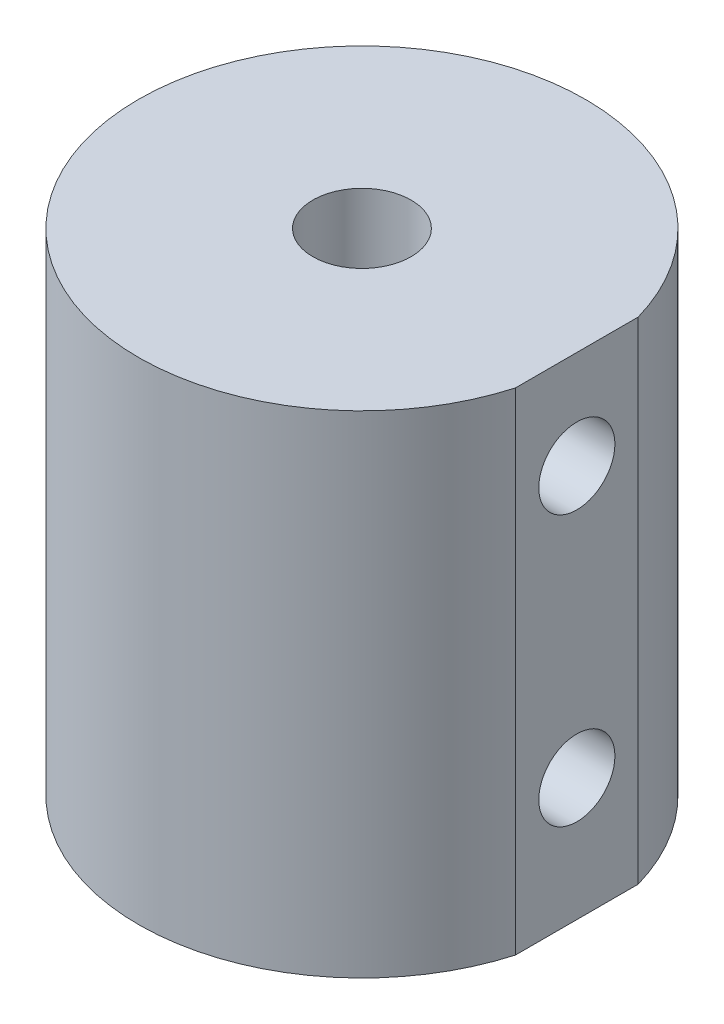
ISO-10303-21;
HEADER;
FILE_DESCRIPTION(('STEP AP214'),'2;1');
FILE_NAME('part.step','',(''),(''),'','','');
FILE_SCHEMA(('AUTOMOTIVE_DESIGN { 1 0 10303 214 1 1 1 1 }'));
ENDSEC;
DATA;
#1=APPLICATION_CONTEXT('core data for automotive mechanical design processes');
#2=APPLICATION_PROTOCOL_DEFINITION('international standard','automotive_design',2000,#1);
#3=PRODUCT_CONTEXT('',#1,'mechanical');
#4=PRODUCT('Part','Part','',(#3));
#5=PRODUCT_RELATED_PRODUCT_CATEGORY('part','',(#4));
#6=PRODUCT_DEFINITION_FORMATION('','',#4);
#7=PRODUCT_DEFINITION_CONTEXT('part definition',#1,'design');
#8=PRODUCT_DEFINITION('design','',#6,#7);
#9=PRODUCT_DEFINITION_SHAPE('','',#8);
#10=(LENGTH_UNIT() NAMED_UNIT(*) SI_UNIT(.MILLI.,.METRE.));
#11=(NAMED_UNIT(*) PLANE_ANGLE_UNIT() SI_UNIT($,.RADIAN.));
#12=(NAMED_UNIT(*) SI_UNIT($,.STERADIAN.) SOLID_ANGLE_UNIT());
#13=UNCERTAINTY_MEASURE_WITH_UNIT(LENGTH_MEASURE(1.E-05),#10,'distance_accuracy_value','');
#14=(GEOMETRIC_REPRESENTATION_CONTEXT(3) GLOBAL_UNCERTAINTY_ASSIGNED_CONTEXT((#13)) GLOBAL_UNIT_ASSIGNED_CONTEXT((#10,
#11,#12)) REPRESENTATION_CONTEXT('',''));
#15=CARTESIAN_POINT('',(0.,0.,0.));
#16=DIRECTION('',(0.,0.,1.));
#17=DIRECTION('',(1.,0.,0.));
#18=AXIS2_PLACEMENT_3D('',#15,#16,#17);
#19=CARTESIAN_POINT('',(0.,22.,0.));
#20=DIRECTION('',(0.,-1.,0.));
#21=DIRECTION('',(0.,0.,-1.));
#22=AXIS2_PLACEMENT_3D('',#19,#20,#21);
#23=CYLINDRICAL_SURFACE('',#22,6.2);
#24=CARTESIAN_POINT('',(5.36935750346352,10.,-3.1));
#25=CARTESIAN_POINT('',(5.36935849423128,9.91919309229893,-3.09999907904929));
#26=CARTESIAN_POINT('',(5.37119000564164,9.83837633491994,-3.09683398248055));
#27=CARTESIAN_POINT('',(5.37843729379027,9.67738498901988,-3.08422684220326));
#28=CARTESIAN_POINT('',(5.38385473918285,9.59721071705589,-3.07478187625349));
#29=CARTESIAN_POINT('',(5.40524473910147,9.35835785194535,-3.03714142666641));
#30=CARTESIAN_POINT('',(5.42635445827456,9.2014907257823,-2.9996406600873));
#31=CARTESIAN_POINT('',(5.47922671825124,8.89806197869233,-2.9019099802584));
#32=CARTESIAN_POINT('',(5.51093253297182,8.7514504048574,-2.84180088991504));
#33=CARTESIAN_POINT('',(5.58132342065871,8.47039514624248,-2.70092929096817));
#34=CARTESIAN_POINT('',(5.62000887116059,8.33595212026258,-2.62016566504122));
#35=CARTESIAN_POINT('',(5.70390269678499,8.07084918231402,-2.43246628698421));
#36=CARTESIAN_POINT('',(5.74938590724018,7.94141585777221,-2.32392131508609));
#37=CARTESIAN_POINT('',(5.83953153192583,7.70163481798747,-2.08708680056294));
#38=CARTESIAN_POINT('',(5.88419352687141,7.59129662280141,-1.9587874691042));
#39=CARTESIAN_POINT('',(5.9712657662185,7.38556158934325,-1.67551764746134));
#40=CARTESIAN_POINT('',(6.0133212937732,7.29167325520853,-1.51933228609627));
#41=CARTESIAN_POINT('',(6.08687344427226,7.13206341932432,-1.19088678230127));
#42=CARTESIAN_POINT('',(6.11837672813838,7.06632414164521,-1.01863686847486));
#43=CARTESIAN_POINT('',(6.1652942972316,6.96973553541119,-0.675939325941493));
#44=CARTESIAN_POINT('',(6.18169388615426,6.93673646769701,-0.506235549496172));
#45=CARTESIAN_POINT('',(6.20023509992105,6.89948503270785,-0.162968949981872));
#46=CARTESIAN_POINT('',(6.2023853517552,6.89521527179667,0.0105914742714049));
#47=CARTESIAN_POINT('',(6.19265243810165,6.9147147003893,0.340480829223517));
#48=CARTESIAN_POINT('',(6.18197336822898,6.93607789101398,0.496995730028075));
#49=CARTESIAN_POINT('',(6.1496016074805,7.00193057320304,0.803872680365835));
#50=CARTESIAN_POINT('',(6.12790809246368,7.04642179529714,0.95423426857585));
#51=CARTESIAN_POINT('',(6.07511906528484,7.15755611762856,1.24715916132865));
#52=CARTESIAN_POINT('',(6.04389762496686,7.22449718224067,1.38958579113101));
#53=CARTESIAN_POINT('',(5.974867088048,7.37821597859821,1.66152790639347));
#54=CARTESIAN_POINT('',(5.93705563412519,7.46500081215998,1.79103874557764));
#55=CARTESIAN_POINT('',(5.85417597108505,7.66537808973752,2.046539077545));
#56=CARTESIAN_POINT('',(5.80875966134252,7.78072912766304,2.17103847180998));
#57=CARTESIAN_POINT('',(5.71808555355372,8.03021839997249,2.39972070652991));
#58=CARTESIAN_POINT('',(5.67282790352699,8.1643709536922,2.50388791583267));
#59=CARTESIAN_POINT('',(5.58446487487709,8.45824821478541,2.69547785312232));
#60=CARTESIAN_POINT('',(5.54167868609022,8.61905585016752,2.78141716281227));
#61=CARTESIAN_POINT('',(5.48612367555622,8.87114848976548,2.88860932108338));
#62=CARTESIAN_POINT('',(5.46904011378611,8.95701152075159,2.92072490586735));
#63=CARTESIAN_POINT('',(5.43841755912045,9.13180222313558,2.97735674116434));
#64=CARTESIAN_POINT('',(5.42487638127782,9.22072796695728,3.00187767779158));
#65=CARTESIAN_POINT('',(5.40283971188006,9.39381734089816,3.04134725583264));
#66=CARTESIAN_POINT('',(5.39403081671987,9.47780440649244,3.05689771063369));
#67=CARTESIAN_POINT('',(5.38028495062534,9.64704974662143,3.08102699974204));
#68=CARTESIAN_POINT('',(5.37534596617756,9.73230733653993,3.0896094595793));
#69=CARTESIAN_POINT('',(5.36954784959061,9.90335337369613,3.09967619271723));
#70=CARTESIAN_POINT('',(5.36868719827086,9.98914161134182,3.1011631091119));
#71=CARTESIAN_POINT('',(5.37106984973299,10.1604626761235,3.09703167288649));
#72=CARTESIAN_POINT('',(5.37431287550024,10.2459955201089,3.09141379986816));
#73=CARTESIAN_POINT('',(5.38887976110589,10.4824211072441,3.06600473072253));
#74=CARTESIAN_POINT('',(5.40453132682514,10.632307837272,3.03858035203519));
#75=CARTESIAN_POINT('',(5.4465105526398,10.9249686078234,2.96266036274304));
#76=CARTESIAN_POINT('',(5.4728416699639,11.0677403282246,2.91415792829889));
#77=CARTESIAN_POINT('',(5.53462406282133,11.3497669740506,2.79510698627724));
#78=CARTESIAN_POINT('',(5.57044125759821,11.4885527588342,2.7236414525805));
#79=CARTESIAN_POINT('',(5.6468393871883,11.7529569363116,2.56149004339049));
#80=CARTESIAN_POINT('',(5.68742276434251,11.8785685151718,2.47079429439281));
#81=CARTESIAN_POINT('',(5.77492805311645,12.1296334808529,2.25939517218993));
#82=CARTESIAN_POINT('',(5.82200410487562,12.25307097993,2.13635033182713));
#83=CARTESIAN_POINT('',(5.91276125721287,12.478178125138,1.87055394808812));
#84=CARTESIAN_POINT('',(5.95644120785165,12.5798404183314,1.72779577469598));
#85=CARTESIAN_POINT('',(6.03698222000196,12.7607784984928,1.42145962058159));
#86=CARTESIAN_POINT('',(6.07363289401112,12.8393926532792,1.25743160191474));
#87=CARTESIAN_POINT('',(6.13438400156203,12.9671275151209,0.916119330951869));
#88=CARTESIAN_POINT('',(6.15849545283517,13.0162741200034,0.738846873228143));
#89=CARTESIAN_POINT('',(6.18969275466686,13.0794425482441,0.393637016212105));
#90=CARTESIAN_POINT('',(6.19813776728391,13.0962734234128,0.226335480172071));
#91=CARTESIAN_POINT('',(6.20130603949982,13.1026141147147,-0.108890560682905));
#92=CARTESIAN_POINT('',(6.19603410258589,13.0921334949559,-0.276814826861375));
#93=CARTESIAN_POINT('',(6.1731530409699,13.0460091701954,-0.596867761287344));
#94=CARTESIAN_POINT('',(6.15637975990525,13.0120690810788,-0.749308131289313));
#95=CARTESIAN_POINT('',(6.11295487836495,12.9222861883669,-1.04608250570255));
#96=CARTESIAN_POINT('',(6.08630186130105,12.8664402437728,-1.19041534421082));
#97=CARTESIAN_POINT('',(6.02410395101986,12.731946580355,-1.47381234992002));
#98=CARTESIAN_POINT('',(5.98822750544064,12.6524257804125,-1.61238714534359));
#99=CARTESIAN_POINT('',(5.91133175494743,12.473928731206,-1.8748021870168));
#100=CARTESIAN_POINT('',(5.8703100910879,12.374943546145,-1.99863562366143));
#101=CARTESIAN_POINT('',(5.78238844780087,12.148935786767,-2.24103013557374));
#102=CARTESIAN_POINT('',(5.73530974688002,12.0201033018673,-2.35784002450804));
#103=CARTESIAN_POINT('',(5.64394937826666,11.7438757276609,-2.56886899975796));
#104=CARTESIAN_POINT('',(5.59967021042567,11.5964643902679,-2.66306809984262));
#105=CARTESIAN_POINT('',(5.53871600737221,11.3613838135882,-2.78654411320572));
#106=CARTESIAN_POINT('',(5.51904593120079,11.2792916723182,-2.82518922387767));
#107=CARTESIAN_POINT('',(5.48258542499175,11.1115016075577,-2.89530966214055));
#108=CARTESIAN_POINT('',(5.46579351278158,11.0258055684604,-2.92678868282136));
#109=CARTESIAN_POINT('',(5.43580056397125,10.8516271098846,-2.98212378739856));
#110=CARTESIAN_POINT('',(5.42259030292728,10.7631525158506,-3.00599948171041));
#111=CARTESIAN_POINT('',(5.40029165279283,10.5839829028419,-3.04587842320017));
#112=CARTESIAN_POINT('',(5.39120038218454,10.4932894830487,-3.06188717451275));
#113=CARTESIAN_POINT('',(5.37941478950005,10.3354212216481,-3.08253027266578));
#114=CARTESIAN_POINT('',(5.37565257341076,10.2685686974628,-3.08907504435993));
#115=CARTESIAN_POINT('',(5.37062343469509,10.134479739307,-3.09781043685213));
#116=CARTESIAN_POINT('',(5.36935667899844,10.0672432799555,-3.10000076636699));
#117=CARTESIAN_POINT('',(5.36935750346352,10.,-3.1));
#118=B_SPLINE_CURVE_WITH_KNOTS('',3,(#24,#25,#26,#27,#28,#29,#30,#31,#32,#33,#34,#35,#36,#37,
#38,#39,#40,#41,#42,#43,#44,#45,#46,#47,#48,#49,#50,#51,#52,#53,#54,#55,#56,#57,#58,#59,#60,#61,
#62,#63,#64,#65,#66,#67,#68,#69,#70,#71,#72,#73,#74,#75,#76,#77,#78,#79,#80,#81,#82,#83,#84,#85,
#86,#87,#88,#89,#90,#91,#92,#93,#94,#95,#96,#97,#98,#99,#100,#101,#102,#103,#104,#105,#106,#107,
#108,#109,#110,#111,#112,#113,#114,#115,#116,#117),.UNSPECIFIED.,.T.,.F.,(4,2,2,2,2,2,2,2,2,2,2,
2,2,2,2,2,2,2,2,2,2,2,2,2,2,2,2,2,2,2,2,2,2,2,2,2,2,2,2,2,2,2,2,2,2,2,4),(0.,0.242347078425021,
0.48480700835774,0.970145396071016,1.45292607569951,1.93573287725712,2.45836059712168,
2.98124813199265,3.53938208777882,4.09716306425778,4.61525546238314,5.13303416264439,
5.60578645039784,6.07857411641826,6.5579030050427,7.03740370823558,7.56223036354076,
8.08745892400063,8.64604152199005,8.92544679990473,9.20467933175738,9.46191920813846,
9.71902515364592,9.97603531956145,10.2330281371869,10.6902809344922,11.1476818738653,
11.6262674369361,12.1050993211688,12.6442902993464,13.1836630626716,13.7372708721493,
14.2903914224193,14.7927616304215,15.2949559389605,15.7640584193636,16.2332281872198,
16.722464520651,17.2119259814697,17.7500987456995,18.2887454765471,18.566945308967,
18.8450014431219,19.1223344979518,19.3994732384786,19.60112830617,19.8027968627891),.UNSPECIFIED.);
#119=CARTESIAN_POINT('',(5.36935750346352,10.,-3.1));
#120=VERTEX_POINT('',#119);
#121=EDGE_CURVE('E143',#120,#120,#118,.T.);
#122=ORIENTED_EDGE('',*,*,#121,.F.);
#123=EDGE_LOOP('',(#122));
#124=FACE_BOUND('',#123,.T.);
#125=CARTESIAN_POINT('',(0.,0.,0.));
#126=DIRECTION('',(0.,1.,0.));
#127=DIRECTION('',(0.,0.,1.));
#128=AXIS2_PLACEMENT_3D('',#125,#126,#127);
#129=CIRCLE('',#128,6.2);
#130=CARTESIAN_POINT('',(-2.,0.,-5.86856030044848));
#131=VERTEX_POINT('',#130);
#132=CARTESIAN_POINT('',(2.,0.,-5.86856030044848));
#133=VERTEX_POINT('',#132);
#134=EDGE_CURVE('E103',#131,#133,#129,.T.);
#135=ORIENTED_EDGE('',*,*,#134,.F.);
#136=DIRECTION('',(0.,-1.,0.));
#137=VECTOR('',#136,1.);
#138=CARTESIAN_POINT('',(-2.,22.,-5.86856030044848));
#139=LINE('',#138,#137);
#140=CARTESIAN_POINT('',(-2.,22.,-5.86856030044848));
#141=VERTEX_POINT('',#140);
#142=EDGE_CURVE('E11',#141,#131,#139,.T.);
#143=ORIENTED_EDGE('',*,*,#142,.F.);
#144=CARTESIAN_POINT('',(0.,22.,0.));
#145=DIRECTION('',(0.,1.,0.));
#146=DIRECTION('',(0.,0.,1.));
#147=AXIS2_PLACEMENT_3D('',#144,#145,#146);
#148=CIRCLE('',#147,6.2);
#149=CARTESIAN_POINT('',(2.,22.,-5.86856030044848));
#150=VERTEX_POINT('',#149);
#151=EDGE_CURVE('E107',#141,#150,#148,.T.);
#152=ORIENTED_EDGE('',*,*,#151,.T.);
#153=DIRECTION('',(0.,-1.,0.));
#154=VECTOR('',#153,1.);
#155=CARTESIAN_POINT('',(2.,22.,-5.86856030044848));
#156=LINE('',#155,#154);
#157=EDGE_CURVE('E88',#150,#133,#156,.T.);
#158=ORIENTED_EDGE('',*,*,#157,.T.);
#159=EDGE_LOOP('',(#135,#143,#152,#158));
#160=FACE_BOUND('',#159,.T.);
#161=ADVANCED_FACE('F39',(#124,#160),#23,.F.);
#162=CARTESIAN_POINT('',(-2.,22.,0.));
#163=DIRECTION('',(-1.,0.,0.));
#164=DIRECTION('',(0.,0.,1.));
#165=AXIS2_PLACEMENT_3D('',#162,#163,#164);
#166=PLANE('',#165);
#167=DIRECTION('',(0.,0.,-1.));
#168=VECTOR('',#167,1.);
#169=CARTESIAN_POINT('',(-2.,0.,0.));
#170=LINE('',#169,#168);
#171=CARTESIAN_POINT('',(-2.,0.,-7.3));
#172=VERTEX_POINT('',#171);
#173=EDGE_CURVE('E97',#131,#172,#170,.T.);
#174=ORIENTED_EDGE('',*,*,#173,.T.);
#175=DIRECTION('',(0.,-1.,0.));
#176=VECTOR('',#175,1.);
#177=CARTESIAN_POINT('',(-2.,22.,-7.3));
#178=LINE('',#177,#176);
#179=CARTESIAN_POINT('',(-2.,22.,-7.3));
#180=VERTEX_POINT('',#179);
#181=EDGE_CURVE('E47',#180,#172,#178,.T.);
#182=ORIENTED_EDGE('',*,*,#181,.F.);
#183=DIRECTION('',(0.,0.,-1.));
#184=VECTOR('',#183,1.);
#185=CARTESIAN_POINT('',(-2.,22.,0.));
#186=LINE('',#185,#184);
#187=EDGE_CURVE('E114',#141,#180,#186,.T.);
#188=ORIENTED_EDGE('',*,*,#187,.F.);
#189=ORIENTED_EDGE('',*,*,#142,.T.);
#190=EDGE_LOOP('',(#174,#182,#188,#189));
#191=FACE_BOUND('',#190,.T.);
#192=ADVANCED_FACE('F120',(#191),#166,.F.);
#193=CARTESIAN_POINT('',(0.,22.,-7.3));
#194=DIRECTION('',(0.,0.,1.));
#195=DIRECTION('',(1.,0.,0.));
#196=AXIS2_PLACEMENT_3D('',#193,#194,#195);
#197=PLANE('',#196);
#198=DIRECTION('',(-1.,0.,0.));
#199=VECTOR('',#198,1.);
#200=CARTESIAN_POINT('',(0.,0.,-7.3));
#201=LINE('',#200,#199);
#202=CARTESIAN_POINT('',(2.,0.,-7.3));
#203=VERTEX_POINT('',#202);
#204=EDGE_CURVE('E91',#203,#172,#201,.T.);
#205=ORIENTED_EDGE('',*,*,#204,.F.);
#206=DIRECTION('',(0.,-1.,0.));
#207=VECTOR('',#206,1.);
#208=CARTESIAN_POINT('',(2.,22.,-7.3));
#209=LINE('',#208,#207);
#210=CARTESIAN_POINT('',(2.,22.,-7.3));
#211=VERTEX_POINT('',#210);
#212=EDGE_CURVE('E80',#211,#203,#209,.T.);
#213=ORIENTED_EDGE('',*,*,#212,.F.);
#214=DIRECTION('',(-1.,0.,0.));
#215=VECTOR('',#214,1.);
#216=CARTESIAN_POINT('',(0.,22.,-7.3));
#217=LINE('',#216,#215);
#218=EDGE_CURVE('E63',#211,#180,#217,.T.);
#219=ORIENTED_EDGE('',*,*,#218,.T.);
#220=ORIENTED_EDGE('',*,*,#181,.T.);
#221=EDGE_LOOP('',(#205,#213,#219,#220));
#222=FACE_BOUND('',#221,.T.);
#223=ADVANCED_FACE('F92',(#222),#197,.T.);
#224=CARTESIAN_POINT('',(2.,22.,0.));
#225=DIRECTION('',(-1.,0.,0.));
#226=DIRECTION('',(0.,0.,1.));
#227=AXIS2_PLACEMENT_3D('',#224,#225,#226);
#228=PLANE('',#227);
#229=DIRECTION('',(0.,0.,-1.));
#230=VECTOR('',#229,1.);
#231=CARTESIAN_POINT('',(2.,0.,0.));
#232=LINE('',#231,#230);
#233=EDGE_CURVE('E85',#133,#203,#232,.T.);
#234=ORIENTED_EDGE('',*,*,#233,.F.);
#235=ORIENTED_EDGE('',*,*,#157,.F.);
#236=DIRECTION('',(0.,0.,-1.));
#237=VECTOR('',#236,1.);
#238=CARTESIAN_POINT('',(2.,22.,0.));
#239=LINE('',#238,#237);
#240=EDGE_CURVE('E86',#150,#211,#239,.T.);
#241=ORIENTED_EDGE('',*,*,#240,.T.);
#242=ORIENTED_EDGE('',*,*,#212,.T.);
#243=EDGE_LOOP('',(#234,#235,#241,#242));
#244=FACE_BOUND('',#243,.T.);
#245=ADVANCED_FACE('F82',(#244),#228,.T.);
#246=CARTESIAN_POINT('',(0.,22.,0.));
#247=DIRECTION('',(0.,-1.,0.));
#248=DIRECTION('',(0.,0.,-1.));
#249=AXIS2_PLACEMENT_3D('',#246,#247,#248);
#250=CYLINDRICAL_SURFACE('',#249,18.2);
#251=CARTESIAN_POINT('',(0.,40.,0.));
#252=DIRECTION('',(0.,1.,0.));
#253=DIRECTION('',(0.,0.,1.));
#254=AXIS2_PLACEMENT_3D('',#251,#252,#253);
#255=CIRCLE('',#254,18.2);
#256=CARTESIAN_POINT('',(17.4997142833819,40.,-5.));
#257=VERTEX_POINT('',#256);
#258=CARTESIAN_POINT('',(17.4997142833819,40.,5.));
#259=VERTEX_POINT('',#258);
#260=EDGE_CURVE('E118',#257,#259,#255,.T.);
#261=ORIENTED_EDGE('',*,*,#260,.F.);
#262=DIRECTION('',(0.,-1.,0.));
#263=VECTOR('',#262,1.);
#264=CARTESIAN_POINT('',(17.4997142833819,40.,-5.));
#265=LINE('',#264,#263);
#266=CARTESIAN_POINT('',(17.4997142833819,0.,-5.));
#267=VERTEX_POINT('',#266);
#268=EDGE_CURVE('E54',#257,#267,#265,.T.);
#269=ORIENTED_EDGE('',*,*,#268,.T.);
#270=CARTESIAN_POINT('',(0.,0.,0.));
#271=DIRECTION('',(0.,1.,0.));
#272=DIRECTION('',(0.,0.,1.));
#273=AXIS2_PLACEMENT_3D('',#270,#271,#272);
#274=CIRCLE('',#273,18.2);
#275=CARTESIAN_POINT('',(17.4997142833819,0.,5.));
#276=VERTEX_POINT('',#275);
#277=EDGE_CURVE('E104',#267,#276,#274,.T.);
#278=ORIENTED_EDGE('',*,*,#277,.T.);
#279=DIRECTION('',(0.,-1.,0.));
#280=VECTOR('',#279,1.);
#281=CARTESIAN_POINT('',(17.4997142833819,40.,5.));
#282=LINE('',#281,#280);
#283=EDGE_CURVE('E136',#259,#276,#282,.T.);
#284=ORIENTED_EDGE('',*,*,#283,.F.);
#285=EDGE_LOOP('',(#261,#269,#278,#284));
#286=FACE_BOUND('',#285,.T.);
#287=ADVANCED_FACE('F184',(#286),#250,.T.);
#288=CARTESIAN_POINT('',(0.,0.,0.));
#289=DIRECTION('',(0.,1.,0.));
#290=DIRECTION('',(0.,0.,1.));
#291=AXIS2_PLACEMENT_3D('',#288,#289,#290);
#292=PLANE('',#291);
#293=ORIENTED_EDGE('',*,*,#134,.T.);
#294=ORIENTED_EDGE('',*,*,#233,.T.);
#295=ORIENTED_EDGE('',*,*,#204,.T.);
#296=ORIENTED_EDGE('',*,*,#173,.F.);
#297=EDGE_LOOP('',(#293,#294,#295,#296));
#298=FACE_BOUND('',#297,.T.);
#299=ORIENTED_EDGE('',*,*,#277,.F.);
#300=DIRECTION('',(0.,0.,-1.));
#301=VECTOR('',#300,1.);
#302=CARTESIAN_POINT('',(17.4997142833819,0.,0.));
#303=LINE('',#302,#301);
#304=EDGE_CURVE('E141',#276,#267,#303,.T.);
#305=ORIENTED_EDGE('',*,*,#304,.F.);
#306=EDGE_LOOP('',(#299,#305));
#307=FACE_BOUND('',#306,.T.);
#308=ADVANCED_FACE('F100',(#298,#307),#292,.F.);
#309=CARTESIAN_POINT('',(0.,40.,0.));
#310=DIRECTION('',(0.,1.,0.));
#311=DIRECTION('',(0.,0.,1.));
#312=AXIS2_PLACEMENT_3D('',#309,#310,#311);
#313=PLANE('',#312);
#314=DIRECTION('',(0.,0.,-1.));
#315=VECTOR('',#314,1.);
#316=CARTESIAN_POINT('',(17.4997142833819,40.,0.));
#317=LINE('',#316,#315);
#318=EDGE_CURVE('E139',#259,#257,#317,.T.);
#319=ORIENTED_EDGE('',*,*,#318,.T.);
#320=ORIENTED_EDGE('',*,*,#260,.T.);
#321=EDGE_LOOP('',(#319,#320));
#322=FACE_BOUND('',#321,.T.);
#323=CARTESIAN_POINT('',(0.,40.,0.));
#324=DIRECTION('',(0.,1.,0.));
#325=DIRECTION('',(0.,0.,1.));
#326=AXIS2_PLACEMENT_3D('',#323,#324,#325);
#327=CIRCLE('',#326,4.);
#328=CARTESIAN_POINT('',(0.,40.,4.));
#329=VERTEX_POINT('',#328);
#330=EDGE_CURVE('E130',#329,#329,#327,.T.);
#331=ORIENTED_EDGE('',*,*,#330,.F.);
#332=EDGE_LOOP('',(#331));
#333=FACE_BOUND('',#332,.T.);
#334=ADVANCED_FACE('F176',(#322,#333),#313,.T.);
#335=CARTESIAN_POINT('',(0.,22.,0.));
#336=DIRECTION('',(0.,1.,0.));
#337=DIRECTION('',(0.,0.,1.));
#338=AXIS2_PLACEMENT_3D('',#335,#336,#337);
#339=PLANE('',#338);
#340=ORIENTED_EDGE('',*,*,#151,.F.);
#341=ORIENTED_EDGE('',*,*,#187,.T.);
#342=ORIENTED_EDGE('',*,*,#218,.F.);
#343=ORIENTED_EDGE('',*,*,#240,.F.);
#344=EDGE_LOOP('',(#340,#341,#342,#343));
#345=FACE_BOUND('',#344,.T.);
#346=CARTESIAN_POINT('',(0.,22.,0.));
#347=DIRECTION('',(0.,1.,0.));
#348=DIRECTION('',(0.,0.,1.));
#349=AXIS2_PLACEMENT_3D('',#346,#347,#348);
#350=CIRCLE('',#349,4.);
#351=CARTESIAN_POINT('',(0.,22.,4.));
#352=VERTEX_POINT('',#351);
#353=EDGE_CURVE('E131',#352,#352,#350,.T.);
#354=ORIENTED_EDGE('',*,*,#353,.T.);
#355=EDGE_LOOP('',(#354));
#356=FACE_BOUND('',#355,.T.);
#357=ADVANCED_FACE('F174',(#345,#356),#339,.F.);
#358=CARTESIAN_POINT('',(0.,40.,0.));
#359=DIRECTION('',(0.,-1.,0.));
#360=DIRECTION('',(0.,0.,-1.));
#361=AXIS2_PLACEMENT_3D('',#358,#359,#360);
#362=CYLINDRICAL_SURFACE('',#361,4.);
#363=CARTESIAN_POINT('',(2.52784493195291,32.,-3.1));
#364=CARTESIAN_POINT('',(2.52784574093324,31.9287444288,-3.09999961919335));
#365=CARTESIAN_POINT('',(2.53087865516696,31.8574846886222,-3.09753439791337));
#366=CARTESIAN_POINT('',(2.54278674023402,31.7158063578104,-3.08776425877451));
#367=CARTESIAN_POINT('',(2.55166274719228,31.6453878890278,-3.0804586482729));
#368=CARTESIAN_POINT('',(2.58634576054128,31.4360221780106,-3.05151757485498));
#369=CARTESIAN_POINT('',(2.62020347776894,31.299324292493,-3.02285944185688));
#370=CARTESIAN_POINT('',(2.7116706727409,31.0066480943885,-2.94130207894632));
#371=CARTESIAN_POINT('',(2.77285031642858,30.8529690788111,-2.88447849264687));
#372=CARTESIAN_POINT('',(2.90617907189171,30.5602617481971,-2.75011335563906));
#373=CARTESIAN_POINT('',(2.97834140587635,30.4212514392729,-2.67254674573847));
#374=CARTESIAN_POINT('',(3.12795783572879,30.1542927845103,-2.49592691468352));
#375=CARTESIAN_POINT('',(3.20550191602767,30.0267406781861,-2.39635362356895));
#376=CARTESIAN_POINT('',(3.35786412946307,29.7878353418276,-2.17772837866786));
#377=CARTESIAN_POINT('',(3.43268424504134,29.6764701472335,-2.05869095152822));
#378=CARTESIAN_POINT('',(3.57119162579646,29.4764389681107,-1.80728422149922));
#379=CARTESIAN_POINT('',(3.63522484105603,29.3869871046996,-1.67573700604701));
#380=CARTESIAN_POINT('',(3.75136978376735,29.2276828068128,-1.39643160562369));
#381=CARTESIAN_POINT('',(3.80349281248997,29.1578117782064,-1.24868898673542));
#382=CARTESIAN_POINT('',(3.88467854744165,29.0501233103386,-0.96323655310253));
#383=CARTESIAN_POINT('',(3.91604298335588,29.0090468100325,-0.827419124069906));
#384=CARTESIAN_POINT('',(3.9646543384196,28.945674844881,-0.549029124361632));
#385=CARTESIAN_POINT('',(3.98191037617888,28.9233672489529,-0.406460979987493));
#386=CARTESIAN_POINT('',(4.00087142946686,28.89886573019,-0.118129121638327));
#387=CARTESIAN_POINT('',(4.00253080821742,28.8967308338112,0.0276427199805986));
#388=CARTESIAN_POINT('',(3.99002636463382,28.9128757892941,0.317364296176516));
#389=CARTESIAN_POINT('',(3.97586031159191,28.9311585191661,0.461313770985022));
#390=CARTESIAN_POINT('',(3.93390568713724,28.9857173493483,0.736867543951287));
#391=CARTESIAN_POINT('',(3.90674542775093,29.0211643741372,0.868736309816124));
#392=CARTESIAN_POINT('',(3.84106018790413,29.1078483275179,1.12412799855321));
#393=CARTESIAN_POINT('',(3.80253256208628,29.1590889316377,1.24764897053534));
#394=CARTESIAN_POINT('',(3.71195871888115,29.2814509094203,1.49690817808534));
#395=CARTESIAN_POINT('',(3.65892208872865,29.3540876658485,1.62153590072287));
#396=CARTESIAN_POINT('',(3.54511945328038,29.5138353142811,1.85722616418611));
#397=CARTESIAN_POINT('',(3.48434791242752,29.6009565860675,1.96827887724334));
#398=CARTESIAN_POINT('',(3.3455770173275,29.8068666936579,2.19738156573621));
#399=CARTESIAN_POINT('',(3.26658445312787,29.9284940127446,2.31227714037589));
#400=CARTESIAN_POINT('',(3.10818793012151,30.1885016039668,2.52117680276785));
#401=CARTESIAN_POINT('',(3.02878368206818,30.326895827885,2.61516330503714));
#402=CARTESIAN_POINT('',(2.88948574724759,30.5963647941671,2.76762533135656));
#403=CARTESIAN_POINT('',(2.82851128916836,30.7250172276746,2.82938377606462));
#404=CARTESIAN_POINT('',(2.71799479675336,30.993814186903,2.93570687800955));
#405=CARTESIAN_POINT('',(2.66842731502255,31.1339321682765,2.98030995883444));
#406=CARTESIAN_POINT('',(2.59848268697305,31.3890690652966,3.04130155928721));
#407=CARTESIAN_POINT('',(2.57393793287508,31.501902515863,3.06191407444128));
#408=CARTESIAN_POINT('',(2.53957213723577,31.7312953634618,3.09048502463638));
#409=CARTESIAN_POINT('',(2.52972558665534,31.8478479458355,3.09846538450472));
#410=CARTESIAN_POINT('',(2.52645548046124,32.0816748920254,3.10113404168258));
#411=CARTESIAN_POINT('',(2.53307754981344,32.1989503611451,3.09578541203147));
#412=CARTESIAN_POINT('',(2.56162678367871,32.4303448539752,3.07219543043969));
#413=CARTESIAN_POINT('',(2.58357732445812,32.5444587795497,3.05393438623849));
#414=CARTESIAN_POINT('',(2.648505876747,32.8031096132307,2.9979604508495));
#415=CARTESIAN_POINT('',(2.69599177574257,32.9455290307461,2.9558629534348));
#416=CARTESIAN_POINT('',(2.80356685356448,33.2189907478413,2.85402988216417));
#417=CARTESIAN_POINT('',(2.86369367675879,33.3499973741492,2.79424140331103));
#418=CARTESIAN_POINT('',(2.96943572156258,33.5597567782698,2.68074488498501));
#419=CARTESIAN_POINT('',(3.01345133300156,33.641701263934,2.63132910245126));
#420=CARTESIAN_POINT('',(3.10268243369498,33.8002592601025,2.52550207156481));
#421=CARTESIAN_POINT('',(3.14789833435684,33.8768709092802,2.46908839965375));
#422=CARTESIAN_POINT('',(3.28325659106917,34.0984595582082,2.28966790336435));
#423=CARTESIAN_POINT('',(3.37324996195008,34.2354522619323,2.15633898902318));
#424=CARTESIAN_POINT('',(3.52930091170493,34.464067044337,1.88786210712049));
#425=CARTESIAN_POINT('',(3.59684370367931,34.5594452697179,1.75675321128739));
#426=CARTESIAN_POINT('',(3.72034524430604,34.7302857309131,1.47724527932996));
#427=CARTESIAN_POINT('',(3.77632232411423,34.8057795356927,1.32887419570529));
#428=CARTESIAN_POINT('',(3.86407836374064,34.9227259878934,1.04282948305594));
#429=CARTESIAN_POINT('',(3.89831638948321,34.9677247640641,0.907367136065986));
#430=CARTESIAN_POINT('',(3.9527987317777,35.0389389222378,0.628859216425344));
#431=CARTESIAN_POINT('',(3.97305070125977,35.0651645768585,0.485817837103503));
#432=CARTESIAN_POINT('',(3.9978779900302,35.0972784624251,0.195574842093251));
#433=CARTESIAN_POINT('',(4.00239804486006,35.1030949990009,0.0483603882724428));
#434=CARTESIAN_POINT('',(3.99518489730408,35.093785903246,-0.244999864279415));
#435=CARTESIAN_POINT('',(3.98345120797968,35.0786596434995,-0.391145630862285));
#436=CARTESIAN_POINT('',(3.94589200602363,35.0298987181386,-0.669786686992205));
#437=CARTESIAN_POINT('',(3.92089064036335,34.9973456092945,-0.802588404312382));
#438=CARTESIAN_POINT('',(3.85919546547977,34.9161761682612,-1.06027503531075));
#439=CARTESIAN_POINT('',(3.8224989038914,34.8675560547394,-1.1851580770927));
#440=CARTESIAN_POINT('',(3.73588114945539,34.7510845077259,-1.43610658497426));
#441=CARTESIAN_POINT('',(3.68505345230532,34.6818746175004,-1.56122234819641));
#442=CARTESIAN_POINT('',(3.57533206525074,34.5289984248222,-1.79836128263819));
#443=CARTESIAN_POINT('',(3.51643337701202,34.4453231555494,-1.91037626028574));
#444=CARTESIAN_POINT('',(3.38154189124031,34.2474635275104,-2.14160046570863));
#445=CARTESIAN_POINT('',(3.30447720482266,34.1305203462367,-2.25782084594889));
#446=CARTESIAN_POINT('',(3.14892062756945,33.8802580932816,-2.47014450840281));
#447=CARTESIAN_POINT('',(3.0704274433841,33.7469234810207,-2.56622846239207));
#448=CARTESIAN_POINT('',(2.92726465663888,33.4799142498945,-2.72790479829566));
#449=CARTESIAN_POINT('',(2.86202272267542,33.3478773115881,-2.79568449106761));
#450=CARTESIAN_POINT('',(2.74261040904931,33.0711953586015,-2.9129131931451));
#451=CARTESIAN_POINT('',(2.68842317247597,32.9265700273405,-2.96239020668371));
#452=CARTESIAN_POINT('',(2.60802030600162,32.6523678417097,-3.03325535723111));
#453=CARTESIAN_POINT('',(2.57854049835115,32.5247035047005,-3.05807821970993));
#454=CARTESIAN_POINT('',(2.54843696280642,32.3296757491235,-3.08311910440383));
#455=CARTESIAN_POINT('',(2.54075566813526,32.264132264257,-3.08943363954351));
#456=CARTESIAN_POINT('',(2.53046042834765,32.1323935123637,-3.09787331229729));
#457=CARTESIAN_POINT('',(2.527844180386,32.066198555297,-3.10000035378076));
#458=CARTESIAN_POINT('',(2.52784493195291,32.,-3.1));
#459=B_SPLINE_CURVE_WITH_KNOTS('',3,(#363,#364,#365,#366,#367,#368,#369,#370,#371,#372,#373,
#374,#375,#376,#377,#378,#379,#380,#381,#382,#383,#384,#385,#386,#387,#388,#389,#390,#391,#392,
#393,#394,#395,#396,#397,#398,#399,#400,#401,#402,#403,#404,#405,#406,#407,#408,#409,#410,#411,
#412,#413,#414,#415,#416,#417,#418,#419,#420,#421,#422,#423,#424,#425,#426,#427,#428,#429,#430,
#431,#432,#433,#434,#435,#436,#437,#438,#439,#440,#441,#442,#443,#444,#445,#446,#447,#448,#449,
#450,#451,#452,#453,#454,#455,#456,#457,#458),.UNSPECIFIED.,.T.,.F.,(4,2,2,2,2,2,2,2,2,2,2,2,2,
2,2,2,2,2,2,2,2,2,2,2,2,2,2,2,2,2,2,2,2,2,2,2,2,2,2,2,2,2,2,2,2,2,2,4),(0.,0.21366508663548,
0.427360754600626,0.855809914955405,1.37772471555354,1.90027290084144,2.43682357490329,
2.97297561829982,3.4854238474628,3.99738378952875,4.43146821760394,4.86527186379722,
5.30034445222653,5.73547837498639,6.15142263765089,6.56746377325979,7.02686356687357,
7.48659400234928,8.03963129362023,8.59313197065744,9.05731973209161,9.52046169300834,
9.87094487688243,10.2208190797802,10.571663659771,10.9230444574904,11.3882347864583,
11.8548305776665,12.1704500007605,12.4861790381844,13.1166595534026,13.641620458639,
14.1657428304334,14.604254077924,15.042525189058,15.4823343522429,15.9221566917562,
16.3374001437265,16.7527413919709,17.2063221476341,17.6601850844362,18.2041795460806,
18.7486938005937,19.233551780756,19.7176647992549,20.1154884025408,20.3140799656732,
20.5125812170768),.UNSPECIFIED.);
#460=CARTESIAN_POINT('',(2.52784493195291,32.,-3.1));
#461=VERTEX_POINT('',#460);
#462=EDGE_CURVE('E151',#461,#461,#459,.T.);
#463=ORIENTED_EDGE('',*,*,#462,.F.);
#464=EDGE_LOOP('',(#463));
#465=FACE_BOUND('',#464,.T.);
#466=ORIENTED_EDGE('',*,*,#330,.T.);
#467=EDGE_LOOP('',(#466));
#468=FACE_BOUND('',#467,.T.);
#469=ORIENTED_EDGE('',*,*,#353,.F.);
#470=EDGE_LOOP('',(#469));
#471=FACE_BOUND('',#470,.T.);
#472=ADVANCED_FACE('F169',(#465,#468,#471),#362,.F.);
#473=CARTESIAN_POINT('',(17.4997142833819,40.,0.));
#474=DIRECTION('',(-1.,0.,0.));
#475=DIRECTION('',(0.,0.,1.));
#476=AXIS2_PLACEMENT_3D('',#473,#474,#475);
#477=PLANE('',#476);
#478=CARTESIAN_POINT('',(17.4997142833819,10.,0.));
#479=DIRECTION('',(1.,0.,0.));
#480=DIRECTION('',(0.,0.,-1.));
#481=AXIS2_PLACEMENT_3D('',#478,#479,#480);
#482=CIRCLE('',#481,3.1);
#483=CARTESIAN_POINT('',(17.4997142833819,10.,-3.1));
#484=VERTEX_POINT('',#483);
#485=EDGE_CURVE('E202',#484,#484,#482,.T.);
#486=ORIENTED_EDGE('',*,*,#485,.F.);
#487=EDGE_LOOP('',(#486));
#488=FACE_BOUND('',#487,.T.);
#489=CARTESIAN_POINT('',(17.4997142833819,32.,0.));
#490=DIRECTION('',(1.,0.,0.));
#491=DIRECTION('',(0.,0.,-1.));
#492=AXIS2_PLACEMENT_3D('',#489,#490,#491);
#493=CIRCLE('',#492,3.1);
#494=CARTESIAN_POINT('',(17.4997142833819,32.,-3.1));
#495=VERTEX_POINT('',#494);
#496=EDGE_CURVE('E203',#495,#495,#493,.T.);
#497=ORIENTED_EDGE('',*,*,#496,.F.);
#498=EDGE_LOOP('',(#497));
#499=FACE_BOUND('',#498,.T.);
#500=ORIENTED_EDGE('',*,*,#304,.T.);
#501=ORIENTED_EDGE('',*,*,#268,.F.);
#502=ORIENTED_EDGE('',*,*,#318,.F.);
#503=ORIENTED_EDGE('',*,*,#283,.T.);
#504=EDGE_LOOP('',(#500,#501,#502,#503));
#505=FACE_BOUND('',#504,.T.);
#506=ADVANCED_FACE('F166',(#488,#499,#505),#477,.F.);
#507=CARTESIAN_POINT('',(-0.500285716618112,32.,0.));
#508=DIRECTION('',(1.,0.,0.));
#509=DIRECTION('',(0.,0.,-1.));
#510=AXIS2_PLACEMENT_3D('',#507,#508,#509);
#511=CYLINDRICAL_SURFACE('',#510,3.1);
#512=ORIENTED_EDGE('',*,*,#462,.T.);
#513=EDGE_LOOP('',(#512));
#514=FACE_BOUND('',#513,.T.);
#515=ORIENTED_EDGE('',*,*,#496,.T.);
#516=EDGE_LOOP('',(#515));
#517=FACE_BOUND('',#516,.T.);
#518=ADVANCED_FACE('F161',(#514,#517),#511,.F.);
#519=CARTESIAN_POINT('',(-0.500285716618112,10.,0.));
#520=DIRECTION('',(1.,0.,0.));
#521=DIRECTION('',(0.,0.,-1.));
#522=AXIS2_PLACEMENT_3D('',#519,#520,#521);
#523=CYLINDRICAL_SURFACE('',#522,3.1);
#524=ORIENTED_EDGE('',*,*,#121,.T.);
#525=EDGE_LOOP('',(#524));
#526=FACE_BOUND('',#525,.T.);
#527=ORIENTED_EDGE('',*,*,#485,.T.);
#528=EDGE_LOOP('',(#527));
#529=FACE_BOUND('',#528,.T.);
#530=ADVANCED_FACE('F158',(#526,#529),#523,.F.);
#531=CLOSED_SHELL('',(#161,#192,#223,#245,#287,#308,#334,#357,#472,#506,#518,#530));
#532=MANIFOLD_SOLID_BREP('B2',#531);
#533=ADVANCED_BREP_SHAPE_REPRESENTATION('',(#18,#532),#14);
#534=SHAPE_DEFINITION_REPRESENTATION(#9,#533);
ENDSEC;
END-ISO-10303-21;
